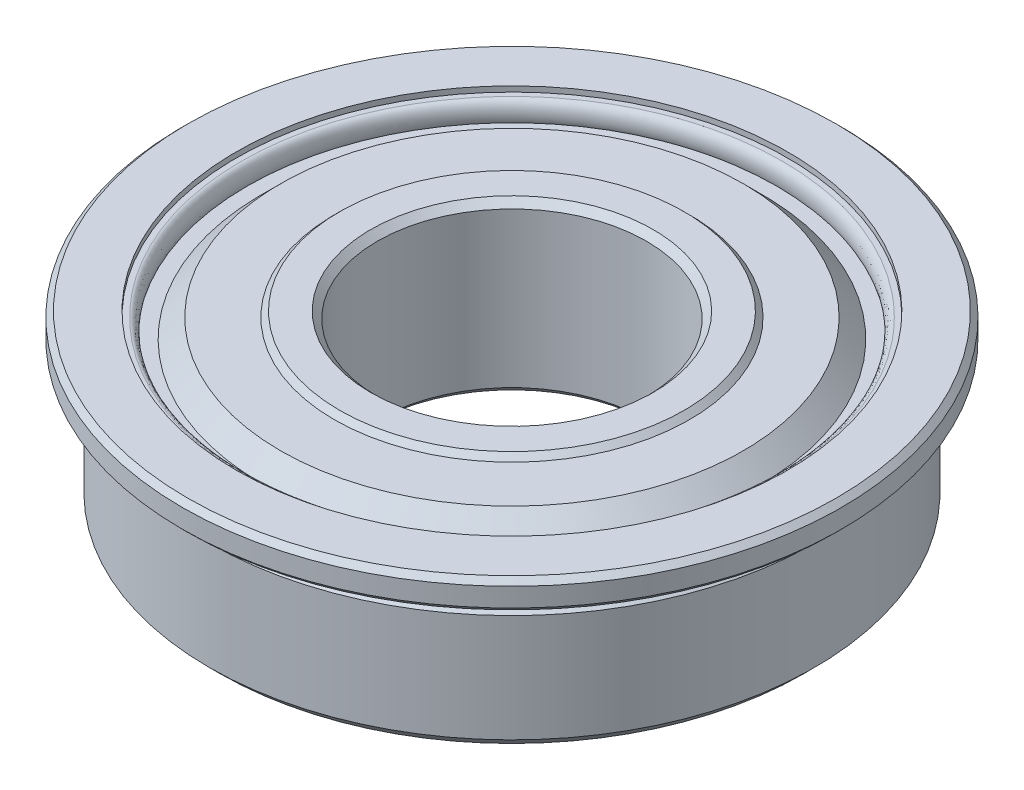
ISO-10303-21;
HEADER;
FILE_DESCRIPTION(('STEP AP214'),'2;1');
FILE_NAME('part.step','',(''),(''),'','','');
FILE_SCHEMA(('AUTOMOTIVE_DESIGN { 1 0 10303 214 1 1 1 1 }'));
ENDSEC;
DATA;
#1=APPLICATION_CONTEXT('core data for automotive mechanical design processes');
#2=APPLICATION_PROTOCOL_DEFINITION('international standard','automotive_design',2000,#1);
#3=PRODUCT_CONTEXT('',#1,'mechanical');
#4=PRODUCT('Part','Part','',(#3));
#5=PRODUCT_RELATED_PRODUCT_CATEGORY('part','',(#4));
#6=PRODUCT_DEFINITION_FORMATION('','',#4);
#7=PRODUCT_DEFINITION_CONTEXT('part definition',#1,'design');
#8=PRODUCT_DEFINITION('design','',#6,#7);
#9=PRODUCT_DEFINITION_SHAPE('','',#8);
#10=(LENGTH_UNIT() NAMED_UNIT(*) SI_UNIT(.MILLI.,.METRE.));
#11=(NAMED_UNIT(*) PLANE_ANGLE_UNIT() SI_UNIT($,.RADIAN.));
#12=(NAMED_UNIT(*) SI_UNIT($,.STERADIAN.) SOLID_ANGLE_UNIT());
#13=UNCERTAINTY_MEASURE_WITH_UNIT(LENGTH_MEASURE(1.E-05),#10,'distance_accuracy_value','');
#14=(GEOMETRIC_REPRESENTATION_CONTEXT(3) GLOBAL_UNCERTAINTY_ASSIGNED_CONTEXT((#13)) GLOBAL_UNIT_ASSIGNED_CONTEXT((#10,
#11,#12)) REPRESENTATION_CONTEXT('',''));
#15=CARTESIAN_POINT('',(0.,0.,0.));
#16=DIRECTION('',(0.,0.,1.));
#17=DIRECTION('',(1.,0.,0.));
#18=AXIS2_PLACEMENT_3D('',#15,#16,#17);
#19=CARTESIAN_POINT('',(0.,-1.524,0.));
#20=DIRECTION('',(0.,-1.,0.));
#21=DIRECTION('',(0.,0.,-1.));
#22=AXIS2_PLACEMENT_3D('',#19,#20,#21);
#23=TOROIDAL_SURFACE('',#22,14.224,0.127);
#24=CARTESIAN_POINT('',(0.,-1.524,0.));
#25=DIRECTION('',(0.,-1.,0.));
#26=DIRECTION('',(0.,0.,-1.));
#27=AXIS2_PLACEMENT_3D('',#24,#25,#26);
#28=CIRCLE('',#27,14.097);
#29=CARTESIAN_POINT('',(0.,-1.524,-14.097));
#30=VERTEX_POINT('',#29);
#31=EDGE_CURVE('E20',#30,#30,#28,.T.);
#32=ORIENTED_EDGE('',*,*,#31,.F.);
#33=EDGE_LOOP('',(#32));
#34=FACE_BOUND('',#33,.T.);
#35=CARTESIAN_POINT('',(0.,-1.397,0.));
#36=DIRECTION('',(0.,1.,0.));
#37=DIRECTION('',(0.,0.,-1.));
#38=AXIS2_PLACEMENT_3D('',#35,#36,#37);
#39=CIRCLE('',#38,14.224);
#40=CARTESIAN_POINT('',(0.,-1.397,-14.224));
#41=VERTEX_POINT('',#40);
#42=EDGE_CURVE('E240',#41,#41,#39,.T.);
#43=ORIENTED_EDGE('',*,*,#42,.F.);
#44=EDGE_LOOP('',(#43));
#45=FACE_BOUND('',#44,.T.);
#46=ADVANCED_FACE('F16',(#34,#45),#23,.F.);
#47=CARTESIAN_POINT('',(0.,-6.7945,0.));
#48=DIRECTION('',(0.,-1.,0.));
#49=DIRECTION('',(0.,0.,-1.));
#50=AXIS2_PLACEMENT_3D('',#47,#48,#49);
#51=PLANE('',#50);
#52=CARTESIAN_POINT('',(0.,-6.7945,0.));
#53=DIRECTION('',(0.,1.,0.));
#54=DIRECTION('',(0.,0.,1.));
#55=AXIS2_PLACEMENT_3D('',#52,#53,#54);
#56=CIRCLE('',#55,11.811);
#57=CARTESIAN_POINT('',(0.,-6.7945,11.811));
#58=VERTEX_POINT('',#57);
#59=EDGE_CURVE('E11',#58,#58,#56,.T.);
#60=ORIENTED_EDGE('',*,*,#59,.T.);
#61=EDGE_LOOP('',(#60));
#62=FACE_BOUND('',#61,.T.);
#63=CARTESIAN_POINT('',(0.,-6.7945,0.));
#64=DIRECTION('',(0.,1.,0.));
#65=DIRECTION('',(0.,0.,1.));
#66=AXIS2_PLACEMENT_3D('',#63,#64,#65);
#67=CIRCLE('',#66,12.4995052843776);
#68=CARTESIAN_POINT('',(0.,-6.7945,12.4995052843776));
#69=VERTEX_POINT('',#68);
#70=EDGE_CURVE('E225',#69,#69,#67,.T.);
#71=ORIENTED_EDGE('',*,*,#70,.F.);
#72=EDGE_LOOP('',(#71));
#73=FACE_BOUND('',#72,.T.);
#74=ADVANCED_FACE('F271',(#62,#73),#51,.T.);
#75=CARTESIAN_POINT('',(0.,-6.7945,0.));
#76=DIRECTION('',(0.,1.,0.));
#77=DIRECTION('',(0.,0.,1.));
#78=AXIS2_PLACEMENT_3D('',#75,#76,#77);
#79=CONICAL_SURFACE('',#78,11.811,0.78539816339745);
#80=CARTESIAN_POINT('',(0.,-7.6835,0.));
#81=DIRECTION('',(0.,1.,0.));
#82=DIRECTION('',(0.,0.,1.));
#83=AXIS2_PLACEMENT_3D('',#80,#81,#82);
#84=CIRCLE('',#83,10.922);
#85=CARTESIAN_POINT('',(0.,-7.6835,10.922));
#86=VERTEX_POINT('',#85);
#87=EDGE_CURVE('E27',#86,#86,#84,.T.);
#88=ORIENTED_EDGE('',*,*,#87,.T.);
#89=EDGE_LOOP('',(#88));
#90=FACE_BOUND('',#89,.T.);
#91=ORIENTED_EDGE('',*,*,#59,.F.);
#92=EDGE_LOOP('',(#91));
#93=FACE_BOUND('',#92,.T.);
#94=ADVANCED_FACE('F255',(#90,#93),#79,.T.);
#95=CARTESIAN_POINT('',(0.,-7.6835,0.));
#96=DIRECTION('',(0.,-1.,0.));
#97=DIRECTION('',(0.,0.,-1.));
#98=AXIS2_PLACEMENT_3D('',#95,#96,#97);
#99=PLANE('',#98);
#100=CARTESIAN_POINT('',(0.,-7.6835,0.));
#101=DIRECTION('',(0.,1.,0.));
#102=DIRECTION('',(0.,0.,1.));
#103=AXIS2_PLACEMENT_3D('',#100,#101,#102);
#104=CIRCLE('',#103,8.382);
#105=CARTESIAN_POINT('',(0.,-7.6835,8.382));
#106=VERTEX_POINT('',#105);
#107=EDGE_CURVE('E183',#106,#106,#104,.T.);
#108=ORIENTED_EDGE('',*,*,#107,.T.);
#109=EDGE_LOOP('',(#108));
#110=FACE_BOUND('',#109,.T.);
#111=ORIENTED_EDGE('',*,*,#87,.F.);
#112=EDGE_LOOP('',(#111));
#113=FACE_BOUND('',#112,.T.);
#114=ADVANCED_FACE('F258',(#110,#113),#99,.T.);
#115=CARTESIAN_POINT('',(0.,-7.6835,0.));
#116=DIRECTION('',(0.,1.,0.));
#117=DIRECTION('',(0.,0.,1.));
#118=AXIS2_PLACEMENT_3D('',#115,#116,#117);
#119=CONICAL_SURFACE('',#118,8.382,0.785398163397448);
#120=CARTESIAN_POINT('',(0.,-7.9375,0.));
#121=DIRECTION('',(0.,1.,0.));
#122=DIRECTION('',(0.,0.,1.));
#123=AXIS2_PLACEMENT_3D('',#120,#121,#122);
#124=CIRCLE('',#123,8.128);
#125=CARTESIAN_POINT('',(0.,-7.9375,8.128));
#126=VERTEX_POINT('',#125);
#127=EDGE_CURVE('E176',#126,#126,#124,.T.);
#128=ORIENTED_EDGE('',*,*,#127,.T.);
#129=EDGE_LOOP('',(#128));
#130=FACE_BOUND('',#129,.T.);
#131=ORIENTED_EDGE('',*,*,#107,.F.);
#132=EDGE_LOOP('',(#131));
#133=FACE_BOUND('',#132,.T.);
#134=ADVANCED_FACE('F260',(#130,#133),#119,.T.);
#135=CARTESIAN_POINT('',(0.,-7.9375,0.));
#136=DIRECTION('',(0.,1.,0.));
#137=DIRECTION('',(0.,0.,-1.));
#138=AXIS2_PLACEMENT_3D('',#135,#136,#137);
#139=PLANE('',#138);
#140=CARTESIAN_POINT('',(0.,-7.9375,0.));
#141=DIRECTION('',(0.,1.,0.));
#142=DIRECTION('',(0.,0.,1.));
#143=AXIS2_PLACEMENT_3D('',#140,#141,#142);
#144=CIRCLE('',#143,6.6675);
#145=CARTESIAN_POINT('',(0.,-7.9375,6.6675));
#146=VERTEX_POINT('',#145);
#147=EDGE_CURVE('E169',#146,#146,#144,.T.);
#148=ORIENTED_EDGE('',*,*,#147,.T.);
#149=EDGE_LOOP('',(#148));
#150=FACE_BOUND('',#149,.T.);
#151=ORIENTED_EDGE('',*,*,#127,.F.);
#152=EDGE_LOOP('',(#151));
#153=FACE_BOUND('',#152,.T.);
#154=ADVANCED_FACE('F268',(#150,#153),#139,.F.);
#155=CARTESIAN_POINT('',(0.,-7.9375,0.));
#156=DIRECTION('',(0.,-1.,0.));
#157=DIRECTION('',(0.,0.,-1.));
#158=AXIS2_PLACEMENT_3D('',#155,#156,#157);
#159=CONICAL_SURFACE('',#158,6.6675,0.785398163397447);
#160=CARTESIAN_POINT('',(0.,-7.62,0.));
#161=DIRECTION('',(0.,1.,0.));
#162=DIRECTION('',(0.,0.,1.));
#163=AXIS2_PLACEMENT_3D('',#160,#161,#162);
#164=CIRCLE('',#163,6.35);
#165=CARTESIAN_POINT('',(0.,-7.62,6.35));
#166=VERTEX_POINT('',#165);
#167=EDGE_CURVE('E161',#166,#166,#164,.T.);
#168=ORIENTED_EDGE('',*,*,#167,.T.);
#169=EDGE_LOOP('',(#168));
#170=FACE_BOUND('',#169,.T.);
#171=ORIENTED_EDGE('',*,*,#147,.F.);
#172=EDGE_LOOP('',(#171));
#173=FACE_BOUND('',#172,.T.);
#174=ADVANCED_FACE('F504',(#170,#173),#159,.F.);
#175=CARTESIAN_POINT('',(0.,0.,0.));
#176=DIRECTION('',(0.,1.,0.));
#177=DIRECTION('',(0.,0.,1.));
#178=AXIS2_PLACEMENT_3D('',#175,#176,#177);
#179=CYLINDRICAL_SURFACE('',#178,6.35);
#180=CARTESIAN_POINT('',(0.,-0.3175,0.));
#181=DIRECTION('',(0.,1.,0.));
#182=DIRECTION('',(0.,0.,1.));
#183=AXIS2_PLACEMENT_3D('',#180,#181,#182);
#184=CIRCLE('',#183,6.35);
#185=CARTESIAN_POINT('',(0.,-0.317500000000004,6.35));
#186=VERTEX_POINT('',#185);
#187=EDGE_CURVE('E153',#186,#186,#184,.T.);
#188=ORIENTED_EDGE('',*,*,#187,.T.);
#189=EDGE_LOOP('',(#188));
#190=FACE_BOUND('',#189,.T.);
#191=ORIENTED_EDGE('',*,*,#167,.F.);
#192=EDGE_LOOP('',(#191));
#193=FACE_BOUND('',#192,.T.);
#194=ADVANCED_FACE('F430',(#190,#193),#179,.F.);
#195=CARTESIAN_POINT('',(0.,-0.3175,0.));
#196=DIRECTION('',(0.,1.,0.));
#197=DIRECTION('',(0.,0.,1.));
#198=AXIS2_PLACEMENT_3D('',#195,#196,#197);
#199=CONICAL_SURFACE('',#198,6.35,0.785398163397448);
#200=ORIENTED_EDGE('',*,*,#187,.F.);
#201=EDGE_LOOP('',(#200));
#202=FACE_BOUND('',#201,.T.);
#203=CARTESIAN_POINT('',(0.,0.,0.));
#204=DIRECTION('',(0.,1.,0.));
#205=DIRECTION('',(0.,0.,1.));
#206=AXIS2_PLACEMENT_3D('',#203,#204,#205);
#207=CIRCLE('',#206,6.6675);
#208=CARTESIAN_POINT('',(0.,0.,6.6675));
#209=VERTEX_POINT('',#208);
#210=EDGE_CURVE('E149',#209,#209,#207,.T.);
#211=ORIENTED_EDGE('',*,*,#210,.T.);
#212=EDGE_LOOP('',(#211));
#213=FACE_BOUND('',#212,.T.);
#214=ADVANCED_FACE('F150',(#202,#213),#199,.F.);
#215=CARTESIAN_POINT('',(0.,0.,0.));
#216=DIRECTION('',(0.,1.,0.));
#217=DIRECTION('',(0.,0.,-1.));
#218=AXIS2_PLACEMENT_3D('',#215,#216,#217);
#219=PLANE('',#218);
#220=ORIENTED_EDGE('',*,*,#210,.F.);
#221=EDGE_LOOP('',(#220));
#222=FACE_BOUND('',#221,.T.);
#223=CARTESIAN_POINT('',(0.,0.,0.));
#224=DIRECTION('',(0.,1.,0.));
#225=DIRECTION('',(0.,0.,1.));
#226=AXIS2_PLACEMENT_3D('',#223,#224,#225);
#227=CIRCLE('',#226,8.128);
#228=CARTESIAN_POINT('',(0.,0.,8.128));
#229=VERTEX_POINT('',#228);
#230=EDGE_CURVE('E154',#229,#229,#227,.T.);
#231=ORIENTED_EDGE('',*,*,#230,.T.);
#232=EDGE_LOOP('',(#231));
#233=FACE_BOUND('',#232,.T.);
#234=ADVANCED_FACE('F429',(#222,#233),#219,.T.);
#235=CARTESIAN_POINT('',(0.,-0.254,0.));
#236=DIRECTION('',(0.,-1.,0.));
#237=DIRECTION('',(0.,0.,-1.));
#238=AXIS2_PLACEMENT_3D('',#235,#236,#237);
#239=CONICAL_SURFACE('',#238,8.382,0.785398163397453);
#240=ORIENTED_EDGE('',*,*,#230,.F.);
#241=EDGE_LOOP('',(#240));
#242=FACE_BOUND('',#241,.T.);
#243=CARTESIAN_POINT('',(0.,-0.254,0.));
#244=DIRECTION('',(0.,1.,0.));
#245=DIRECTION('',(0.,0.,1.));
#246=AXIS2_PLACEMENT_3D('',#243,#244,#245);
#247=CIRCLE('',#246,8.382);
#248=CARTESIAN_POINT('',(0.,-0.254,8.382));
#249=VERTEX_POINT('',#248);
#250=EDGE_CURVE('E163',#249,#249,#247,.T.);
#251=ORIENTED_EDGE('',*,*,#250,.T.);
#252=EDGE_LOOP('',(#251));
#253=FACE_BOUND('',#252,.T.);
#254=ADVANCED_FACE('F18',(#242,#253),#239,.T.);
#255=CARTESIAN_POINT('',(0.,-0.254,0.));
#256=DIRECTION('',(0.,-1.,0.));
#257=DIRECTION('',(0.,0.,-1.));
#258=AXIS2_PLACEMENT_3D('',#255,#256,#257);
#259=PLANE('',#258);
#260=ORIENTED_EDGE('',*,*,#250,.F.);
#261=EDGE_LOOP('',(#260));
#262=FACE_BOUND('',#261,.T.);
#263=CARTESIAN_POINT('',(0.,-0.254,0.));
#264=DIRECTION('',(0.,1.,0.));
#265=DIRECTION('',(0.,0.,1.));
#266=AXIS2_PLACEMENT_3D('',#263,#264,#265);
#267=CIRCLE('',#266,10.922);
#268=CARTESIAN_POINT('',(0.,-0.254000000000004,10.922));
#269=VERTEX_POINT('',#268);
#270=EDGE_CURVE('E166',#269,#269,#267,.T.);
#271=ORIENTED_EDGE('',*,*,#270,.T.);
#272=EDGE_LOOP('',(#271));
#273=FACE_BOUND('',#272,.T.);
#274=ADVANCED_FACE('F287',(#262,#273),#259,.F.);
#275=CARTESIAN_POINT('',(0.,-1.143,0.));
#276=DIRECTION('',(0.,-1.,0.));
#277=DIRECTION('',(0.,0.,-1.));
#278=AXIS2_PLACEMENT_3D('',#275,#276,#277);
#279=CONICAL_SURFACE('',#278,11.811,0.785398163397448);
#280=ORIENTED_EDGE('',*,*,#270,.F.);
#281=EDGE_LOOP('',(#280));
#282=FACE_BOUND('',#281,.T.);
#283=CARTESIAN_POINT('',(0.,-1.143,0.));
#284=DIRECTION('',(0.,1.,0.));
#285=DIRECTION('',(0.,0.,1.));
#286=AXIS2_PLACEMENT_3D('',#283,#284,#285);
#287=CIRCLE('',#286,11.811);
#288=CARTESIAN_POINT('',(0.,-1.143,11.811));
#289=VERTEX_POINT('',#288);
#290=EDGE_CURVE('E216',#289,#289,#287,.T.);
#291=ORIENTED_EDGE('',*,*,#290,.T.);
#292=EDGE_LOOP('',(#291));
#293=FACE_BOUND('',#292,.T.);
#294=ADVANCED_FACE('F290',(#282,#293),#279,.T.);
#295=CARTESIAN_POINT('',(0.,-1.143,0.));
#296=DIRECTION('',(0.,-1.,0.));
#297=DIRECTION('',(0.,0.,-1.));
#298=AXIS2_PLACEMENT_3D('',#295,#296,#297);
#299=PLANE('',#298);
#300=ORIENTED_EDGE('',*,*,#290,.F.);
#301=EDGE_LOOP('',(#300));
#302=FACE_BOUND('',#301,.T.);
#303=CARTESIAN_POINT('',(0.,-1.143,0.));
#304=DIRECTION('',(0.,1.,0.));
#305=DIRECTION('',(0.,0.,1.));
#306=AXIS2_PLACEMENT_3D('',#303,#304,#305);
#307=CIRCLE('',#306,12.4995052843776);
#308=CARTESIAN_POINT('',(0.,-1.143,12.4995052843776));
#309=VERTEX_POINT('',#308);
#310=EDGE_CURVE('E219',#309,#309,#307,.T.);
#311=ORIENTED_EDGE('',*,*,#310,.T.);
#312=EDGE_LOOP('',(#311));
#313=FACE_BOUND('',#312,.T.);
#314=ADVANCED_FACE('F302',(#302,#313),#299,.F.);
#315=CARTESIAN_POINT('',(0.,-0.254,-12.7635));
#316=CARTESIAN_POINT('',(-25.527,-0.254,-12.7635));
#317=CARTESIAN_POINT('',(-25.527,-0.254000000000003,12.7635));
#318=CARTESIAN_POINT('',(0.,-0.254,12.7635));
#319=CARTESIAN_POINT('',(25.527,-0.254000000000003,12.7635));
#320=CARTESIAN_POINT('',(25.527,-0.254,-12.7635));
#321=CARTESIAN_POINT('',(0.,-0.254,-12.7635));
#322=CARTESIAN_POINT('',(0.,-0.253999999999997,-12.4752486336249));
#323=CARTESIAN_POINT('',(-24.9504972672497,-0.253999999999997,-12.4752486336248));
#324=CARTESIAN_POINT('',(-24.9504972672497,-0.254,12.4752486336248));
#325=CARTESIAN_POINT('',(0.,-0.254,12.4752486336249));
#326=CARTESIAN_POINT('',(24.9504972672497,-0.254,12.4752486336248));
#327=CARTESIAN_POINT('',(24.9504972672497,-0.253999999999997,-12.4752486336248));
#328=CARTESIAN_POINT('',(0.,-0.253999999999997,-12.4752486336249));
#329=CARTESIAN_POINT('',(0.,-0.711584858301911,-12.3393656363914));
#330=CARTESIAN_POINT('',(-24.6787312727828,-0.71158485830191,-12.3393656363914));
#331=CARTESIAN_POINT('',(-24.6787312727828,-0.711584858301915,12.3393656363914));
#332=CARTESIAN_POINT('',(0.,-0.711584858301914,12.3393656363914));
#333=CARTESIAN_POINT('',(24.6787312727828,-0.711584858301915,12.3393656363914));
#334=CARTESIAN_POINT('',(24.6787312727828,-0.71158485830191,-12.3393656363914));
#335=CARTESIAN_POINT('',(0.,-0.711584858301911,-12.3393656363914));
#336=CARTESIAN_POINT('',(0.,-1.143,-12.4995052843776));
#337=CARTESIAN_POINT('',(-24.9990105687552,-1.143,-12.4995052843776));
#338=CARTESIAN_POINT('',(-24.9990105687552,-1.143,12.4995052843776));
#339=CARTESIAN_POINT('',(0.,-1.143,12.4995052843776));
#340=CARTESIAN_POINT('',(24.9990105687552,-1.143,12.4995052843776));
#341=CARTESIAN_POINT('',(24.9990105687552,-1.143,-12.4995052843776));
#342=CARTESIAN_POINT('',(0.,-1.143,-12.4995052843776));
#343=(BOUNDED_SURFACE() B_SPLINE_SURFACE(3,3,((#315,#316,#317,#318,#319,#320,#321),(#322,#323,
#324,#325,#326,#327,#328),(#329,#330,#331,#332,#333,#334,#335),(#336,#337,#338,#339,#340,#341,
#342)),.UNSPECIFIED.,.F.,.T.,.F.) B_SPLINE_SURFACE_WITH_KNOTS((4,4),(4,3,4),(0.,1.),(0.,0.5,1.),
.UNSPECIFIED.) GEOMETRIC_REPRESENTATION_ITEM() RATIONAL_B_SPLINE_SURFACE(((1.,0.333333333333334,
0.333333333333334,1.,0.333333333333334,0.333333333333334,1.),(0.647603013860685,
0.215867671286895,0.215867671286895,0.647603013860685,0.215867671286895,0.215867671286895,
0.647603013860685),(0.647603013860685,0.215867671286895,0.215867671286895,0.647603013860685,
0.215867671286895,0.215867671286895,0.647603013860685),(1.,0.333333333333334,0.333333333333334,
1.,0.333333333333334,0.333333333333334,1.))) REPRESENTATION_ITEM('') SURFACE());
#344=CARTESIAN_POINT('',(0.,-0.254,0.));
#345=DIRECTION('',(0.,1.,0.));
#346=DIRECTION('',(0.,0.,1.));
#347=AXIS2_PLACEMENT_3D('',#344,#345,#346);
#348=CIRCLE('',#347,12.7635);
#349=CARTESIAN_POINT('',(0.,-0.254,12.7635));
#350=VERTEX_POINT('',#349);
#351=EDGE_CURVE('E235',#350,#350,#348,.T.);
#352=ORIENTED_EDGE('',*,*,#310,.F.);
#353=EDGE_LOOP('',(#352));
#354=FACE_BOUND('',#353,.T.);
#355=ORIENTED_EDGE('',*,*,#351,.T.);
#356=EDGE_LOOP('',(#355));
#357=FACE_BOUND('',#356,.T.);
#358=ADVANCED_FACE('F298',(#354,#357),#343,.F.);
#359=CARTESIAN_POINT('',(0.,-0.254,0.));
#360=DIRECTION('',(0.,-1.,0.));
#361=DIRECTION('',(0.,0.,-1.));
#362=AXIS2_PLACEMENT_3D('',#359,#360,#361);
#363=PLANE('',#362);
#364=ORIENTED_EDGE('',*,*,#351,.F.);
#365=EDGE_LOOP('',(#364));
#366=FACE_BOUND('',#365,.T.);
#367=CARTESIAN_POINT('',(0.,-0.254,0.));
#368=DIRECTION('',(0.,1.,0.));
#369=DIRECTION('',(0.,0.,1.));
#370=AXIS2_PLACEMENT_3D('',#367,#368,#369);
#371=CIRCLE('',#370,13.0175);
#372=CARTESIAN_POINT('',(0.,-0.254,13.0175));
#373=VERTEX_POINT('',#372);
#374=EDGE_CURVE('E121',#373,#373,#371,.T.);
#375=ORIENTED_EDGE('',*,*,#374,.T.);
#376=EDGE_LOOP('',(#375));
#377=FACE_BOUND('',#376,.T.);
#378=ADVANCED_FACE('F286',(#366,#377),#363,.F.);
#379=CARTESIAN_POINT('',(0.,0.,0.));
#380=DIRECTION('',(0.,1.,0.));
#381=DIRECTION('',(0.,0.,1.));
#382=AXIS2_PLACEMENT_3D('',#379,#380,#381);
#383=CYLINDRICAL_SURFACE('',#382,13.0175);
#384=ORIENTED_EDGE('',*,*,#374,.F.);
#385=EDGE_LOOP('',(#384));
#386=FACE_BOUND('',#385,.T.);
#387=CARTESIAN_POINT('',(0.,0.,0.));
#388=DIRECTION('',(0.,1.,0.));
#389=DIRECTION('',(0.,0.,1.));
#390=AXIS2_PLACEMENT_3D('',#387,#388,#389);
#391=CIRCLE('',#390,13.0175);
#392=CARTESIAN_POINT('',(0.,0.,13.0175));
#393=VERTEX_POINT('',#392);
#394=EDGE_CURVE('E131',#393,#393,#391,.T.);
#395=ORIENTED_EDGE('',*,*,#394,.T.);
#396=EDGE_LOOP('',(#395));
#397=FACE_BOUND('',#396,.T.);
#398=ADVANCED_FACE('F321',(#386,#397),#383,.F.);
#399=CARTESIAN_POINT('',(0.,0.,0.));
#400=DIRECTION('',(0.,1.,0.));
#401=DIRECTION('',(0.,0.,-1.));
#402=AXIS2_PLACEMENT_3D('',#399,#400,#401);
#403=PLANE('',#402);
#404=ORIENTED_EDGE('',*,*,#394,.F.);
#405=EDGE_LOOP('',(#404));
#406=FACE_BOUND('',#405,.T.);
#407=CARTESIAN_POINT('',(0.,0.,0.));
#408=DIRECTION('',(0.,1.,0.));
#409=DIRECTION('',(0.,0.,1.));
#410=AXIS2_PLACEMENT_3D('',#407,#408,#409);
#411=CIRCLE('',#410,15.3035);
#412=CARTESIAN_POINT('',(0.,0.,15.3035));
#413=VERTEX_POINT('',#412);
#414=EDGE_CURVE('E214',#413,#413,#411,.T.);
#415=ORIENTED_EDGE('',*,*,#414,.T.);
#416=EDGE_LOOP('',(#415));
#417=FACE_BOUND('',#416,.T.);
#418=ADVANCED_FACE('F312',(#406,#417),#403,.T.);
#419=CARTESIAN_POINT('',(0.,0.,0.));
#420=DIRECTION('',(0.,-1.,0.));
#421=DIRECTION('',(0.,0.,-1.));
#422=AXIS2_PLACEMENT_3D('',#419,#420,#421);
#423=CONICAL_SURFACE('',#422,15.3035,0.785398163397457);
#424=ORIENTED_EDGE('',*,*,#414,.F.);
#425=EDGE_LOOP('',(#424));
#426=FACE_BOUND('',#425,.T.);
#427=CARTESIAN_POINT('',(0.,-0.254,0.));
#428=DIRECTION('',(0.,1.,0.));
#429=DIRECTION('',(0.,0.,1.));
#430=AXIS2_PLACEMENT_3D('',#427,#428,#429);
#431=CIRCLE('',#430,15.5575);
#432=CARTESIAN_POINT('',(0.,-0.254,15.5575));
#433=VERTEX_POINT('',#432);
#434=EDGE_CURVE('E224',#433,#433,#431,.T.);
#435=ORIENTED_EDGE('',*,*,#434,.T.);
#436=EDGE_LOOP('',(#435));
#437=FACE_BOUND('',#436,.T.);
#438=ADVANCED_FACE('F304',(#426,#437),#423,.T.);
#439=CARTESIAN_POINT('',(0.,0.,0.));
#440=DIRECTION('',(0.,1.,0.));
#441=DIRECTION('',(0.,0.,1.));
#442=AXIS2_PLACEMENT_3D('',#439,#440,#441);
#443=CYLINDRICAL_SURFACE('',#442,15.5575);
#444=CARTESIAN_POINT('',(0.,-1.143,0.));
#445=DIRECTION('',(0.,1.,0.));
#446=DIRECTION('',(0.,0.,1.));
#447=AXIS2_PLACEMENT_3D('',#444,#445,#446);
#448=CIRCLE('',#447,15.5575);
#449=CARTESIAN_POINT('',(0.,-1.143,15.5575));
#450=VERTEX_POINT('',#449);
#451=EDGE_CURVE('E187',#450,#450,#448,.T.);
#452=ORIENTED_EDGE('',*,*,#451,.T.);
#453=EDGE_LOOP('',(#452));
#454=FACE_BOUND('',#453,.T.);
#455=ORIENTED_EDGE('',*,*,#434,.F.);
#456=EDGE_LOOP('',(#455));
#457=FACE_BOUND('',#456,.T.);
#458=ADVANCED_FACE('F311',(#454,#457),#443,.T.);
#459=CARTESIAN_POINT('',(0.,-1.397,0.));
#460=DIRECTION('',(0.,1.,0.));
#461=DIRECTION('',(0.,0.,1.));
#462=AXIS2_PLACEMENT_3D('',#459,#460,#461);
#463=CONICAL_SURFACE('',#462,15.3035,0.785398163397453);
#464=CARTESIAN_POINT('',(0.,-1.397,0.));
#465=DIRECTION('',(0.,1.,0.));
#466=DIRECTION('',(0.,0.,1.));
#467=AXIS2_PLACEMENT_3D('',#464,#465,#466);
#468=CIRCLE('',#467,15.3035);
#469=CARTESIAN_POINT('',(0.,-1.397,15.3035));
#470=VERTEX_POINT('',#469);
#471=EDGE_CURVE('E202',#470,#470,#468,.T.);
#472=ORIENTED_EDGE('',*,*,#471,.T.);
#473=EDGE_LOOP('',(#472));
#474=FACE_BOUND('',#473,.T.);
#475=ORIENTED_EDGE('',*,*,#451,.F.);
#476=EDGE_LOOP('',(#475));
#477=FACE_BOUND('',#476,.T.);
#478=ADVANCED_FACE('F318',(#474,#477),#463,.T.);
#479=CARTESIAN_POINT('',(0.,-1.397,0.));
#480=DIRECTION('',(0.,-1.,0.));
#481=DIRECTION('',(0.,0.,-1.));
#482=AXIS2_PLACEMENT_3D('',#479,#480,#481);
#483=PLANE('',#482);
#484=ORIENTED_EDGE('',*,*,#42,.T.);
#485=EDGE_LOOP('',(#484));
#486=FACE_BOUND('',#485,.T.);
#487=ORIENTED_EDGE('',*,*,#471,.F.);
#488=EDGE_LOOP('',(#487));
#489=FACE_BOUND('',#488,.T.);
#490=ADVANCED_FACE('F453',(#486,#489),#483,.T.);
#491=CARTESIAN_POINT('',(0.,0.,0.));
#492=DIRECTION('',(0.,1.,0.));
#493=DIRECTION('',(0.,0.,1.));
#494=AXIS2_PLACEMENT_3D('',#491,#492,#493);
#495=CYLINDRICAL_SURFACE('',#494,14.097);
#496=ORIENTED_EDGE('',*,*,#31,.T.);
#497=EDGE_LOOP('',(#496));
#498=FACE_BOUND('',#497,.T.);
#499=CARTESIAN_POINT('',(0.,-2.159,0.));
#500=DIRECTION('',(0.,1.,0.));
#501=DIRECTION('',(0.,0.,1.));
#502=AXIS2_PLACEMENT_3D('',#499,#500,#501);
#503=CIRCLE('',#502,14.097);
#504=CARTESIAN_POINT('',(0.,-2.159,14.097));
#505=VERTEX_POINT('',#504);
#506=EDGE_CURVE('E193',#505,#505,#503,.T.);
#507=ORIENTED_EDGE('',*,*,#506,.T.);
#508=EDGE_LOOP('',(#507));
#509=FACE_BOUND('',#508,.T.);
#510=ADVANCED_FACE('F471',(#498,#509),#495,.T.);
#511=CARTESIAN_POINT('',(0.,-2.3495,0.));
#512=DIRECTION('',(0.,-1.,0.));
#513=DIRECTION('',(0.,0.,-1.));
#514=AXIS2_PLACEMENT_3D('',#511,#512,#513);
#515=CONICAL_SURFACE('',#514,14.2875,0.785398163397443);
#516=ORIENTED_EDGE('',*,*,#506,.F.);
#517=EDGE_LOOP('',(#516));
#518=FACE_BOUND('',#517,.T.);
#519=CARTESIAN_POINT('',(0.,-2.3495,0.));
#520=DIRECTION('',(0.,1.,0.));
#521=DIRECTION('',(0.,0.,1.));
#522=AXIS2_PLACEMENT_3D('',#519,#520,#521);
#523=CIRCLE('',#522,14.2875);
#524=CARTESIAN_POINT('',(0.,-2.3495,14.2875));
#525=VERTEX_POINT('',#524);
#526=EDGE_CURVE('E195',#525,#525,#523,.T.);
#527=ORIENTED_EDGE('',*,*,#526,.T.);
#528=EDGE_LOOP('',(#527));
#529=FACE_BOUND('',#528,.T.);
#530=ADVANCED_FACE('F296',(#518,#529),#515,.T.);
#531=CARTESIAN_POINT('',(0.,0.,0.));
#532=DIRECTION('',(0.,1.,0.));
#533=DIRECTION('',(0.,0.,1.));
#534=AXIS2_PLACEMENT_3D('',#531,#532,#533);
#535=CYLINDRICAL_SURFACE('',#534,14.2875);
#536=CARTESIAN_POINT('',(0.,-7.4295,0.));
#537=DIRECTION('',(0.,1.,0.));
#538=DIRECTION('',(0.,0.,1.));
#539=AXIS2_PLACEMENT_3D('',#536,#537,#538);
#540=CIRCLE('',#539,14.2875);
#541=CARTESIAN_POINT('',(0.,-7.4295,14.2875));
#542=VERTEX_POINT('',#541);
#543=EDGE_CURVE('E191',#542,#542,#540,.T.);
#544=ORIENTED_EDGE('',*,*,#543,.T.);
#545=EDGE_LOOP('',(#544));
#546=FACE_BOUND('',#545,.T.);
#547=ORIENTED_EDGE('',*,*,#526,.F.);
#548=EDGE_LOOP('',(#547));
#549=FACE_BOUND('',#548,.T.);
#550=ADVANCED_FACE('F292',(#546,#549),#535,.T.);
#551=CARTESIAN_POINT('',(0.,-7.4295,0.));
#552=DIRECTION('',(0.,1.,0.));
#553=DIRECTION('',(0.,0.,1.));
#554=AXIS2_PLACEMENT_3D('',#551,#552,#553);
#555=CONICAL_SURFACE('',#554,14.2875,0.785398163397445);
#556=CARTESIAN_POINT('',(0.,-7.9375,0.));
#557=DIRECTION('',(0.,1.,0.));
#558=DIRECTION('',(0.,0.,1.));
#559=AXIS2_PLACEMENT_3D('',#556,#557,#558);
#560=CIRCLE('',#559,13.7795);
#561=CARTESIAN_POINT('',(0.,-7.9375,13.7795));
#562=VERTEX_POINT('',#561);
#563=EDGE_CURVE('E189',#562,#562,#560,.T.);
#564=ORIENTED_EDGE('',*,*,#563,.T.);
#565=EDGE_LOOP('',(#564));
#566=FACE_BOUND('',#565,.T.);
#567=ORIENTED_EDGE('',*,*,#543,.F.);
#568=EDGE_LOOP('',(#567));
#569=FACE_BOUND('',#568,.T.);
#570=ADVANCED_FACE('F295',(#566,#569),#555,.T.);
#571=CARTESIAN_POINT('',(0.,-7.9375,0.));
#572=DIRECTION('',(0.,-1.,0.));
#573=DIRECTION('',(0.,0.,-1.));
#574=AXIS2_PLACEMENT_3D('',#571,#572,#573);
#575=PLANE('',#574);
#576=CARTESIAN_POINT('',(0.,-7.9375,0.));
#577=DIRECTION('',(0.,1.,0.));
#578=DIRECTION('',(0.,0.,1.));
#579=AXIS2_PLACEMENT_3D('',#576,#577,#578);
#580=CIRCLE('',#579,13.0175);
#581=CARTESIAN_POINT('',(0.,-7.9375,13.0175));
#582=VERTEX_POINT('',#581);
#583=EDGE_CURVE('E192',#582,#582,#580,.T.);
#584=ORIENTED_EDGE('',*,*,#583,.T.);
#585=EDGE_LOOP('',(#584));
#586=FACE_BOUND('',#585,.T.);
#587=ORIENTED_EDGE('',*,*,#563,.F.);
#588=EDGE_LOOP('',(#587));
#589=FACE_BOUND('',#588,.T.);
#590=ADVANCED_FACE('F348',(#586,#589),#575,.T.);
#591=CARTESIAN_POINT('',(0.,0.,0.));
#592=DIRECTION('',(0.,1.,0.));
#593=DIRECTION('',(0.,0.,1.));
#594=AXIS2_PLACEMENT_3D('',#591,#592,#593);
#595=CYLINDRICAL_SURFACE('',#594,13.0175);
#596=CARTESIAN_POINT('',(0.,-7.6835,0.));
#597=DIRECTION('',(0.,1.,0.));
#598=DIRECTION('',(0.,0.,1.));
#599=AXIS2_PLACEMENT_3D('',#596,#597,#598);
#600=CIRCLE('',#599,13.0175);
#601=CARTESIAN_POINT('',(0.,-7.6835,13.0175));
#602=VERTEX_POINT('',#601);
#603=EDGE_CURVE('E228',#602,#602,#600,.T.);
#604=ORIENTED_EDGE('',*,*,#603,.T.);
#605=EDGE_LOOP('',(#604));
#606=FACE_BOUND('',#605,.T.);
#607=ORIENTED_EDGE('',*,*,#583,.F.);
#608=EDGE_LOOP('',(#607));
#609=FACE_BOUND('',#608,.T.);
#610=ADVANCED_FACE('F340',(#606,#609),#595,.F.);
#611=CARTESIAN_POINT('',(0.,-7.6835,0.));
#612=DIRECTION('',(0.,-1.,0.));
#613=DIRECTION('',(0.,0.,-1.));
#614=AXIS2_PLACEMENT_3D('',#611,#612,#613);
#615=PLANE('',#614);
#616=CARTESIAN_POINT('',(0.,-7.6835,0.));
#617=DIRECTION('',(0.,1.,0.));
#618=DIRECTION('',(0.,0.,1.));
#619=AXIS2_PLACEMENT_3D('',#616,#617,#618);
#620=CIRCLE('',#619,12.7635);
#621=CARTESIAN_POINT('',(0.,-7.6835,12.7635));
#622=VERTEX_POINT('',#621);
#623=EDGE_CURVE('E229',#622,#622,#620,.T.);
#624=ORIENTED_EDGE('',*,*,#623,.T.);
#625=EDGE_LOOP('',(#624));
#626=FACE_BOUND('',#625,.T.);
#627=ORIENTED_EDGE('',*,*,#603,.F.);
#628=EDGE_LOOP('',(#627));
#629=FACE_BOUND('',#628,.T.);
#630=ADVANCED_FACE('F337',(#626,#629),#615,.T.);
#631=CARTESIAN_POINT('',(0.,-7.6835,-12.7635));
#632=CARTESIAN_POINT('',(-25.527,-7.68349999999999,-12.7635));
#633=CARTESIAN_POINT('',(-25.527,-7.68349999999999,12.7635));
#634=CARTESIAN_POINT('',(0.,-7.6835,12.7635));
#635=CARTESIAN_POINT('',(25.527,-7.68349999999999,12.7635));
#636=CARTESIAN_POINT('',(25.527,-7.68349999999999,-12.7635));
#637=CARTESIAN_POINT('',(0.,-7.6835,-12.7635));
#638=CARTESIAN_POINT('',(0.,-7.6835,-12.4752486336249));
#639=CARTESIAN_POINT('',(-24.9504972672497,-7.68349999999999,-12.4752486336248));
#640=CARTESIAN_POINT('',(-24.9504972672497,-7.68349999999999,12.4752486336248));
#641=CARTESIAN_POINT('',(0.,-7.68350000000001,12.4752486336249));
#642=CARTESIAN_POINT('',(24.9504972672497,-7.68349999999999,12.4752486336248));
#643=CARTESIAN_POINT('',(24.9504972672497,-7.68349999999999,-12.4752486336248));
#644=CARTESIAN_POINT('',(0.,-7.6835,-12.4752486336249));
#645=CARTESIAN_POINT('',(0.,-7.22591514169809,-12.3393656363914));
#646=CARTESIAN_POINT('',(-24.6787312727828,-7.22591514169809,-12.3393656363914));
#647=CARTESIAN_POINT('',(-24.6787312727828,-7.22591514169809,12.3393656363914));
#648=CARTESIAN_POINT('',(0.,-7.22591514169809,12.3393656363914));
#649=CARTESIAN_POINT('',(24.6787312727828,-7.22591514169809,12.3393656363914));
#650=CARTESIAN_POINT('',(24.6787312727828,-7.22591514169809,-12.3393656363914));
#651=CARTESIAN_POINT('',(0.,-7.22591514169809,-12.3393656363914));
#652=CARTESIAN_POINT('',(0.,-6.7945,-12.4995052843776));
#653=CARTESIAN_POINT('',(-24.9990105687552,-6.79449999999999,-12.4995052843776));
#654=CARTESIAN_POINT('',(-24.9990105687552,-6.7945,12.4995052843776));
#655=CARTESIAN_POINT('',(0.,-6.7945,12.4995052843776));
#656=CARTESIAN_POINT('',(24.9990105687552,-6.7945,12.4995052843776));
#657=CARTESIAN_POINT('',(24.9990105687552,-6.79449999999999,-12.4995052843776));
#658=CARTESIAN_POINT('',(0.,-6.7945,-12.4995052843776));
#659=(BOUNDED_SURFACE() B_SPLINE_SURFACE(3,3,((#631,#632,#633,#634,#635,#636,#637),(#638,#639,
#640,#641,#642,#643,#644),(#645,#646,#647,#648,#649,#650,#651),(#652,#653,#654,#655,#656,#657,
#658)),.UNSPECIFIED.,.F.,.T.,.F.) B_SPLINE_SURFACE_WITH_KNOTS((4,4),(4,3,4),(0.,1.),(0.,0.5,1.),
.UNSPECIFIED.) GEOMETRIC_REPRESENTATION_ITEM() RATIONAL_B_SPLINE_SURFACE(((1.,0.333333333333334,
0.333333333333334,1.,0.333333333333334,0.333333333333334,1.),(0.647603013860686,
0.215867671286896,0.215867671286896,0.647603013860686,0.215867671286896,0.215867671286896,
0.647603013860686),(0.647603013860686,0.215867671286896,0.215867671286896,0.647603013860686,
0.215867671286896,0.215867671286896,0.647603013860686),(1.,0.333333333333334,0.333333333333334,
1.,0.333333333333334,0.333333333333334,1.))) REPRESENTATION_ITEM('') SURFACE());
#660=ORIENTED_EDGE('',*,*,#70,.T.);
#661=EDGE_LOOP('',(#660));
#662=FACE_BOUND('',#661,.T.);
#663=ORIENTED_EDGE('',*,*,#623,.F.);
#664=EDGE_LOOP('',(#663));
#665=FACE_BOUND('',#664,.T.);
#666=ADVANCED_FACE('F339',(#662,#665),#659,.T.);
#667=CLOSED_SHELL('',(#46,#74,#94,#114,#134,#154,#174,#194,#214,#234,#254,#274,#294,#314,#358,
#378,#398,#418,#438,#458,#478,#490,#510,#530,#550,#570,#590,#610,#630,#666));
#668=MANIFOLD_SOLID_BREP('B1',#667);
#669=ADVANCED_BREP_SHAPE_REPRESENTATION('',(#18,#668),#14);
#670=SHAPE_DEFINITION_REPRESENTATION(#9,#669);
ENDSEC;
END-ISO-10303-21;
